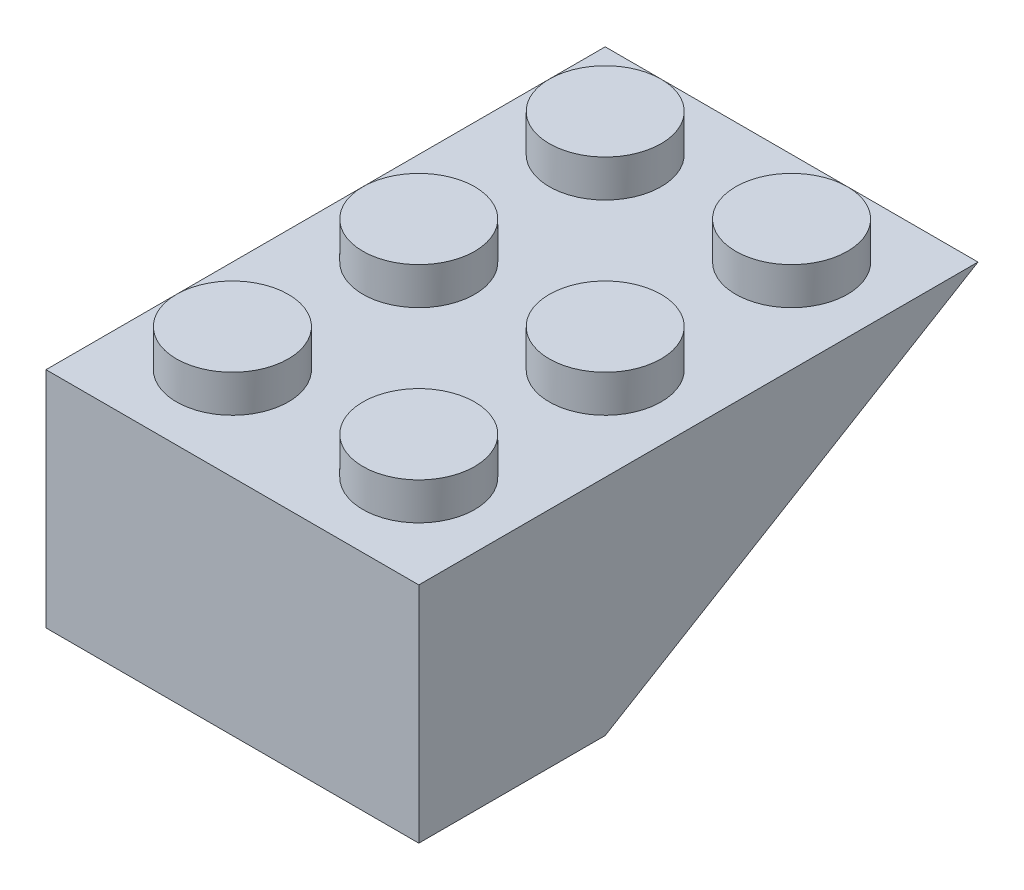
ISO-10303-21;
HEADER;
FILE_DESCRIPTION(('STEP AP214'),'2;1');
FILE_NAME('part.step','',(''),(''),'','','');
FILE_SCHEMA(('AUTOMOTIVE_DESIGN { 1 0 10303 214 1 1 1 1 }'));
ENDSEC;
DATA;
#1=APPLICATION_CONTEXT('core data for automotive mechanical design processes');
#2=APPLICATION_PROTOCOL_DEFINITION('international standard','automotive_design',2000,#1);
#3=PRODUCT_CONTEXT('',#1,'mechanical');
#4=PRODUCT('Part','Part','',(#3));
#5=PRODUCT_RELATED_PRODUCT_CATEGORY('part','',(#4));
#6=PRODUCT_DEFINITION_FORMATION('','',#4);
#7=PRODUCT_DEFINITION_CONTEXT('part definition',#1,'design');
#8=PRODUCT_DEFINITION('design','',#6,#7);
#9=PRODUCT_DEFINITION_SHAPE('','',#8);
#10=(LENGTH_UNIT() NAMED_UNIT(*) SI_UNIT(.MILLI.,.METRE.));
#11=(NAMED_UNIT(*) PLANE_ANGLE_UNIT() SI_UNIT($,.RADIAN.));
#12=(NAMED_UNIT(*) SI_UNIT($,.STERADIAN.) SOLID_ANGLE_UNIT());
#13=UNCERTAINTY_MEASURE_WITH_UNIT(LENGTH_MEASURE(1.E-05),#10,'distance_accuracy_value','');
#14=(GEOMETRIC_REPRESENTATION_CONTEXT(3) GLOBAL_UNCERTAINTY_ASSIGNED_CONTEXT((#13)) GLOBAL_UNIT_ASSIGNED_CONTEXT((#10,
#11,#12)) REPRESENTATION_CONTEXT('',''));
#15=CARTESIAN_POINT('',(0.,0.,0.));
#16=DIRECTION('',(0.,0.,1.));
#17=DIRECTION('',(1.,0.,0.));
#18=AXIS2_PLACEMENT_3D('',#15,#16,#17);
#19=CARTESIAN_POINT('',(0.,0.,0.));
#20=DIRECTION('',(0.,-1.,0.));
#21=DIRECTION('',(0.,0.,-1.));
#22=AXIS2_PLACEMENT_3D('',#19,#20,#21);
#23=PLANE('',#22);
#24=DIRECTION('',(0.,0.,1.));
#25=VECTOR('',#24,1.);
#26=CARTESIAN_POINT('',(0.,0.,0.));
#27=LINE('',#26,#25);
#28=CARTESIAN_POINT('',(0.,0.,-8.));
#29=VERTEX_POINT('',#28);
#30=CARTESIAN_POINT('',(0.,0.,0.));
#31=VERTEX_POINT('',#30);
#32=EDGE_CURVE('E79',#29,#31,#27,.T.);
#33=ORIENTED_EDGE('',*,*,#32,.F.);
#34=DIRECTION('',(-1.,0.,0.));
#35=VECTOR('',#34,1.);
#36=CARTESIAN_POINT('',(0.,0.,-8.));
#37=LINE('',#36,#35);
#38=CARTESIAN_POINT('',(16.,0.,-8.));
#39=VERTEX_POINT('',#38);
#40=EDGE_CURVE('E84',#39,#29,#37,.T.);
#41=ORIENTED_EDGE('',*,*,#40,.F.);
#42=DIRECTION('',(0.,0.,-1.));
#43=VECTOR('',#42,1.);
#44=CARTESIAN_POINT('',(16.,0.,0.));
#45=LINE('',#44,#43);
#46=CARTESIAN_POINT('',(16.,0.,0.));
#47=VERTEX_POINT('',#46);
#48=EDGE_CURVE('E103',#47,#39,#45,.T.);
#49=ORIENTED_EDGE('',*,*,#48,.F.);
#50=DIRECTION('',(1.,0.,0.));
#51=VECTOR('',#50,1.);
#52=CARTESIAN_POINT('',(0.,0.,0.));
#53=LINE('',#52,#51);
#54=EDGE_CURVE('E86',#31,#47,#53,.T.);
#55=ORIENTED_EDGE('',*,*,#54,.F.);
#56=EDGE_LOOP('',(#33,#41,#49,#55));
#57=FACE_BOUND('',#56,.T.);
#58=DIRECTION('',(-1.,0.,0.));
#59=VECTOR('',#58,1.);
#60=CARTESIAN_POINT('',(0.,0.,-6.4));
#61=LINE('',#60,#59);
#62=CARTESIAN_POINT('',(14.4,0.,-6.4));
#63=VERTEX_POINT('',#62);
#64=CARTESIAN_POINT('',(1.6,0.,-6.4));
#65=VERTEX_POINT('',#64);
#66=EDGE_CURVE('E123',#63,#65,#61,.T.);
#67=ORIENTED_EDGE('',*,*,#66,.T.);
#68=DIRECTION('',(0.,0.,1.));
#69=VECTOR('',#68,1.);
#70=CARTESIAN_POINT('',(1.6,0.,0.));
#71=LINE('',#70,#69);
#72=CARTESIAN_POINT('',(1.6,0.,-1.6));
#73=VERTEX_POINT('',#72);
#74=EDGE_CURVE('E109',#65,#73,#71,.T.);
#75=ORIENTED_EDGE('',*,*,#74,.T.);
#76=DIRECTION('',(1.,0.,0.));
#77=VECTOR('',#76,1.);
#78=CARTESIAN_POINT('',(0.,0.,-1.6));
#79=LINE('',#78,#77);
#80=CARTESIAN_POINT('',(14.4,0.,-1.6));
#81=VERTEX_POINT('',#80);
#82=EDGE_CURVE('E140',#73,#81,#79,.T.);
#83=ORIENTED_EDGE('',*,*,#82,.T.);
#84=DIRECTION('',(0.,0.,-1.));
#85=VECTOR('',#84,1.);
#86=CARTESIAN_POINT('',(14.4,0.,0.));
#87=LINE('',#86,#85);
#88=EDGE_CURVE('E54',#81,#63,#87,.T.);
#89=ORIENTED_EDGE('',*,*,#88,.T.);
#90=EDGE_LOOP('',(#67,#75,#83,#89));
#91=FACE_BOUND('',#90,.T.);
#92=ADVANCED_FACE('F39',(#57,#91),#23,.T.);
#93=CARTESIAN_POINT('',(0.,9.6,0.));
#94=DIRECTION('',(1.,0.,0.));
#95=DIRECTION('',(0.,0.,-1.));
#96=AXIS2_PLACEMENT_3D('',#93,#94,#95);
#97=PLANE('',#96);
#98=ORIENTED_EDGE('',*,*,#32,.T.);
#99=DIRECTION('',(0.,-1.,0.));
#100=VECTOR('',#99,1.);
#101=CARTESIAN_POINT('',(0.,9.6,0.));
#102=LINE('',#101,#100);
#103=CARTESIAN_POINT('',(0.,9.6,0.));
#104=VERTEX_POINT('',#103);
#105=EDGE_CURVE('E155',#104,#31,#102,.T.);
#106=ORIENTED_EDGE('',*,*,#105,.F.);
#107=DIRECTION('',(0.,0.,1.));
#108=VECTOR('',#107,1.);
#109=CARTESIAN_POINT('',(0.,9.6,0.));
#110=LINE('',#109,#108);
#111=CARTESIAN_POINT('',(0.,9.6,-24.));
#112=VERTEX_POINT('',#111);
#113=EDGE_CURVE('E102',#112,#104,#110,.T.);
#114=ORIENTED_EDGE('',*,*,#113,.F.);
#115=DIRECTION('',(0.,0.514495755427526,-0.857492925712544));
#116=VECTOR('',#115,1.);
#117=CARTESIAN_POINT('',(0.,0.,-8.));
#118=LINE('',#117,#116);
#119=EDGE_CURVE('E99',#29,#112,#118,.T.);
#120=ORIENTED_EDGE('',*,*,#119,.F.);
#121=EDGE_LOOP('',(#98,#106,#114,#120));
#122=FACE_BOUND('',#121,.T.);
#123=ADVANCED_FACE('F41',(#122),#97,.F.);
#124=CARTESIAN_POINT('',(0.,9.6,0.));
#125=DIRECTION('',(0.,0.,-1.));
#126=DIRECTION('',(-1.,0.,0.));
#127=AXIS2_PLACEMENT_3D('',#124,#125,#126);
#128=PLANE('',#127);
#129=ORIENTED_EDGE('',*,*,#54,.T.);
#130=DIRECTION('',(0.,-1.,0.));
#131=VECTOR('',#130,1.);
#132=CARTESIAN_POINT('',(16.,9.6,0.));
#133=LINE('',#132,#131);
#134=CARTESIAN_POINT('',(16.,9.6,0.));
#135=VERTEX_POINT('',#134);
#136=EDGE_CURVE('E149',#135,#47,#133,.T.);
#137=ORIENTED_EDGE('',*,*,#136,.F.);
#138=DIRECTION('',(1.,0.,0.));
#139=VECTOR('',#138,1.);
#140=CARTESIAN_POINT('',(0.,9.6,0.));
#141=LINE('',#140,#139);
#142=EDGE_CURVE('E63',#104,#135,#141,.T.);
#143=ORIENTED_EDGE('',*,*,#142,.F.);
#144=ORIENTED_EDGE('',*,*,#105,.T.);
#145=EDGE_LOOP('',(#129,#137,#143,#144));
#146=FACE_BOUND('',#145,.T.);
#147=ADVANCED_FACE('F188',(#146),#128,.F.);
#148=CARTESIAN_POINT('',(16.,9.6,0.));
#149=DIRECTION('',(-1.,0.,0.));
#150=DIRECTION('',(0.,0.,1.));
#151=AXIS2_PLACEMENT_3D('',#148,#149,#150);
#152=PLANE('',#151);
#153=ORIENTED_EDGE('',*,*,#48,.T.);
#154=DIRECTION('',(0.,0.514495755427526,-0.857492925712544));
#155=VECTOR('',#154,1.);
#156=CARTESIAN_POINT('',(16.,0.,-8.));
#157=LINE('',#156,#155);
#158=CARTESIAN_POINT('',(16.,9.6,-24.));
#159=VERTEX_POINT('',#158);
#160=EDGE_CURVE('E101',#39,#159,#157,.T.);
#161=ORIENTED_EDGE('',*,*,#160,.T.);
#162=DIRECTION('',(0.,0.,-1.));
#163=VECTOR('',#162,1.);
#164=CARTESIAN_POINT('',(16.,9.6,0.));
#165=LINE('',#164,#163);
#166=EDGE_CURVE('E148',#135,#159,#165,.T.);
#167=ORIENTED_EDGE('',*,*,#166,.F.);
#168=ORIENTED_EDGE('',*,*,#136,.T.);
#169=EDGE_LOOP('',(#153,#161,#167,#168));
#170=FACE_BOUND('',#169,.T.);
#171=ADVANCED_FACE('F177',(#170),#152,.F.);
#172=CARTESIAN_POINT('',(0.,9.6,0.));
#173=DIRECTION('',(0.,-1.,0.));
#174=DIRECTION('',(0.,0.,-1.));
#175=AXIS2_PLACEMENT_3D('',#172,#173,#174);
#176=PLANE('',#175);
#177=CARTESIAN_POINT('',(4.,9.6,-20.));
#178=DIRECTION('',(0.,-1.,0.));
#179=DIRECTION('',(0.,0.,-1.));
#180=AXIS2_PLACEMENT_3D('',#177,#178,#179);
#181=CIRCLE('',#180,2.4);
#182=CARTESIAN_POINT('',(4.,9.6,-22.4));
#183=VERTEX_POINT('',#182);
#184=EDGE_CURVE('E11',#183,#183,#181,.F.);
#185=ORIENTED_EDGE('',*,*,#184,.F.);
#186=EDGE_LOOP('',(#185));
#187=FACE_BOUND('',#186,.T.);
#188=CARTESIAN_POINT('',(4.,9.6,-12.));
#189=DIRECTION('',(0.,-1.,0.));
#190=DIRECTION('',(0.,0.,-1.));
#191=AXIS2_PLACEMENT_3D('',#188,#189,#190);
#192=CIRCLE('',#191,2.4);
#193=CARTESIAN_POINT('',(4.,9.6,-14.4));
#194=VERTEX_POINT('',#193);
#195=EDGE_CURVE('E47',#194,#194,#192,.F.);
#196=ORIENTED_EDGE('',*,*,#195,.F.);
#197=EDGE_LOOP('',(#196));
#198=FACE_BOUND('',#197,.T.);
#199=CARTESIAN_POINT('',(4.,9.6,-4.));
#200=DIRECTION('',(0.,-1.,0.));
#201=DIRECTION('',(0.,0.,-1.));
#202=AXIS2_PLACEMENT_3D('',#199,#200,#201);
#203=CIRCLE('',#202,2.4);
#204=CARTESIAN_POINT('',(4.,9.6,-6.4));
#205=VERTEX_POINT('',#204);
#206=EDGE_CURVE('E166',#205,#205,#203,.F.);
#207=ORIENTED_EDGE('',*,*,#206,.F.);
#208=EDGE_LOOP('',(#207));
#209=FACE_BOUND('',#208,.T.);
#210=CARTESIAN_POINT('',(12.,9.6,-20.));
#211=DIRECTION('',(0.,-1.,0.));
#212=DIRECTION('',(0.,0.,-1.));
#213=AXIS2_PLACEMENT_3D('',#210,#211,#212);
#214=CIRCLE('',#213,2.4);
#215=CARTESIAN_POINT('',(12.,9.6,-22.4));
#216=VERTEX_POINT('',#215);
#217=EDGE_CURVE('E163',#216,#216,#214,.F.);
#218=ORIENTED_EDGE('',*,*,#217,.F.);
#219=EDGE_LOOP('',(#218));
#220=FACE_BOUND('',#219,.T.);
#221=CARTESIAN_POINT('',(12.,9.6,-12.));
#222=DIRECTION('',(0.,-1.,0.));
#223=DIRECTION('',(0.,0.,-1.));
#224=AXIS2_PLACEMENT_3D('',#221,#222,#223);
#225=CIRCLE('',#224,2.4);
#226=CARTESIAN_POINT('',(12.,9.6,-14.4));
#227=VERTEX_POINT('',#226);
#228=EDGE_CURVE('E160',#227,#227,#225,.F.);
#229=ORIENTED_EDGE('',*,*,#228,.F.);
#230=EDGE_LOOP('',(#229));
#231=FACE_BOUND('',#230,.T.);
#232=CARTESIAN_POINT('',(12.,9.6,-4.));
#233=DIRECTION('',(0.,-1.,0.));
#234=DIRECTION('',(0.,0.,-1.));
#235=AXIS2_PLACEMENT_3D('',#232,#233,#234);
#236=CIRCLE('',#235,2.4);
#237=CARTESIAN_POINT('',(12.,9.6,-6.4));
#238=VERTEX_POINT('',#237);
#239=EDGE_CURVE('E157',#238,#238,#236,.F.);
#240=ORIENTED_EDGE('',*,*,#239,.F.);
#241=EDGE_LOOP('',(#240));
#242=FACE_BOUND('',#241,.T.);
#243=ORIENTED_EDGE('',*,*,#113,.T.);
#244=ORIENTED_EDGE('',*,*,#142,.T.);
#245=ORIENTED_EDGE('',*,*,#166,.T.);
#246=DIRECTION('',(1.,0.,0.));
#247=VECTOR('',#246,1.);
#248=CARTESIAN_POINT('',(0.,9.6,-24.));
#249=LINE('',#248,#247);
#250=EDGE_CURVE('E107',#112,#159,#249,.T.);
#251=ORIENTED_EDGE('',*,*,#250,.F.);
#252=EDGE_LOOP('',(#243,#244,#245,#251));
#253=FACE_BOUND('',#252,.T.);
#254=ADVANCED_FACE('F173',(#187,#198,#209,#220,#231,#242,#253),#176,.F.);
#255=CARTESIAN_POINT('',(1.6,9.6,0.));
#256=DIRECTION('',(1.,0.,0.));
#257=DIRECTION('',(0.,0.,-1.));
#258=AXIS2_PLACEMENT_3D('',#255,#256,#257);
#259=PLANE('',#258);
#260=ORIENTED_EDGE('',*,*,#74,.F.);
#261=DIRECTION('',(0.,-1.,0.));
#262=VECTOR('',#261,1.);
#263=CARTESIAN_POINT('',(1.6,9.6,-6.4));
#264=LINE('',#263,#262);
#265=CARTESIAN_POINT('',(1.6,8.,-6.4));
#266=VERTEX_POINT('',#265);
#267=EDGE_CURVE('E124',#266,#65,#264,.T.);
#268=ORIENTED_EDGE('',*,*,#267,.F.);
#269=DIRECTION('',(0.,0.,1.));
#270=VECTOR('',#269,1.);
#271=CARTESIAN_POINT('',(1.6,8.,0.));
#272=LINE('',#271,#270);
#273=CARTESIAN_POINT('',(1.6,8.,-1.6));
#274=VERTEX_POINT('',#273);
#275=EDGE_CURVE('E119',#266,#274,#272,.T.);
#276=ORIENTED_EDGE('',*,*,#275,.T.);
#277=DIRECTION('',(0.,-1.,0.));
#278=VECTOR('',#277,1.);
#279=CARTESIAN_POINT('',(1.6,9.6,-1.6));
#280=LINE('',#279,#278);
#281=EDGE_CURVE('E91',#274,#73,#280,.T.);
#282=ORIENTED_EDGE('',*,*,#281,.T.);
#283=EDGE_LOOP('',(#260,#268,#276,#282));
#284=FACE_BOUND('',#283,.T.);
#285=ADVANCED_FACE('F176',(#284),#259,.T.);
#286=CARTESIAN_POINT('',(0.,9.6,-1.6));
#287=DIRECTION('',(0.,0.,-1.));
#288=DIRECTION('',(-1.,0.,0.));
#289=AXIS2_PLACEMENT_3D('',#286,#287,#288);
#290=PLANE('',#289);
#291=ORIENTED_EDGE('',*,*,#82,.F.);
#292=ORIENTED_EDGE('',*,*,#281,.F.);
#293=DIRECTION('',(1.,0.,0.));
#294=VECTOR('',#293,1.);
#295=CARTESIAN_POINT('',(0.,8.,-1.6));
#296=LINE('',#295,#294);
#297=CARTESIAN_POINT('',(14.4,8.,-1.6));
#298=VERTEX_POINT('',#297);
#299=EDGE_CURVE('E122',#274,#298,#296,.T.);
#300=ORIENTED_EDGE('',*,*,#299,.T.);
#301=DIRECTION('',(0.,-1.,0.));
#302=VECTOR('',#301,1.);
#303=CARTESIAN_POINT('',(14.4,9.6,-1.6));
#304=LINE('',#303,#302);
#305=EDGE_CURVE('E118',#298,#81,#304,.T.);
#306=ORIENTED_EDGE('',*,*,#305,.T.);
#307=EDGE_LOOP('',(#291,#292,#300,#306));
#308=FACE_BOUND('',#307,.T.);
#309=ADVANCED_FACE('F211',(#308),#290,.T.);
#310=CARTESIAN_POINT('',(14.4,9.6,0.));
#311=DIRECTION('',(-1.,0.,0.));
#312=DIRECTION('',(0.,0.,1.));
#313=AXIS2_PLACEMENT_3D('',#310,#311,#312);
#314=PLANE('',#313);
#315=ORIENTED_EDGE('',*,*,#88,.F.);
#316=ORIENTED_EDGE('',*,*,#305,.F.);
#317=DIRECTION('',(0.,0.,-1.));
#318=VECTOR('',#317,1.);
#319=CARTESIAN_POINT('',(14.4,8.,0.));
#320=LINE('',#319,#318);
#321=CARTESIAN_POINT('',(14.4,8.,-6.4));
#322=VERTEX_POINT('',#321);
#323=EDGE_CURVE('E132',#298,#322,#320,.T.);
#324=ORIENTED_EDGE('',*,*,#323,.T.);
#325=DIRECTION('',(0.,-1.,0.));
#326=VECTOR('',#325,1.);
#327=CARTESIAN_POINT('',(14.4,9.6,-6.4));
#328=LINE('',#327,#326);
#329=EDGE_CURVE('E127',#322,#63,#328,.T.);
#330=ORIENTED_EDGE('',*,*,#329,.T.);
#331=EDGE_LOOP('',(#315,#316,#324,#330));
#332=FACE_BOUND('',#331,.T.);
#333=ADVANCED_FACE('F224',(#332),#314,.T.);
#334=CARTESIAN_POINT('',(0.,9.6,-6.4));
#335=DIRECTION('',(0.,0.,1.));
#336=DIRECTION('',(1.,0.,0.));
#337=AXIS2_PLACEMENT_3D('',#334,#335,#336);
#338=PLANE('',#337);
#339=ORIENTED_EDGE('',*,*,#66,.F.);
#340=ORIENTED_EDGE('',*,*,#329,.F.);
#341=DIRECTION('',(-1.,0.,0.));
#342=VECTOR('',#341,1.);
#343=CARTESIAN_POINT('',(0.,8.,-6.4));
#344=LINE('',#343,#342);
#345=EDGE_CURVE('E128',#322,#266,#344,.T.);
#346=ORIENTED_EDGE('',*,*,#345,.T.);
#347=ORIENTED_EDGE('',*,*,#267,.T.);
#348=EDGE_LOOP('',(#339,#340,#346,#347));
#349=FACE_BOUND('',#348,.T.);
#350=ADVANCED_FACE('F219',(#349),#338,.T.);
#351=CARTESIAN_POINT('',(0.,8.,0.));
#352=DIRECTION('',(0.,-1.,0.));
#353=DIRECTION('',(0.,0.,-1.));
#354=AXIS2_PLACEMENT_3D('',#351,#352,#353);
#355=PLANE('',#354);
#356=ORIENTED_EDGE('',*,*,#275,.F.);
#357=ORIENTED_EDGE('',*,*,#345,.F.);
#358=ORIENTED_EDGE('',*,*,#323,.F.);
#359=ORIENTED_EDGE('',*,*,#299,.F.);
#360=EDGE_LOOP('',(#356,#357,#358,#359));
#361=FACE_BOUND('',#360,.T.);
#362=ADVANCED_FACE('F222',(#361),#355,.T.);
#363=CARTESIAN_POINT('',(0.,0.,-8.));
#364=DIRECTION('',(0.,-0.857492925712544,-0.514495755427526));
#365=DIRECTION('',(0.,0.514495755427526,-0.857492925712544));
#366=AXIS2_PLACEMENT_3D('',#363,#364,#365);
#367=PLANE('',#366);
#368=ORIENTED_EDGE('',*,*,#160,.F.);
#369=ORIENTED_EDGE('',*,*,#40,.T.);
#370=ORIENTED_EDGE('',*,*,#119,.T.);
#371=ORIENTED_EDGE('',*,*,#250,.T.);
#372=EDGE_LOOP('',(#368,#369,#370,#371));
#373=FACE_BOUND('',#372,.T.);
#374=ADVANCED_FACE('F96',(#373),#367,.T.);
#375=CARTESIAN_POINT('',(12.,11.2,-4.));
#376=DIRECTION('',(0.,-1.,0.));
#377=DIRECTION('',(0.,0.,-1.));
#378=AXIS2_PLACEMENT_3D('',#375,#376,#377);
#379=CYLINDRICAL_SURFACE('',#378,2.4);
#380=CARTESIAN_POINT('',(12.,11.2,-4.));
#381=DIRECTION('',(0.,1.,0.));
#382=DIRECTION('',(0.,0.,1.));
#383=AXIS2_PLACEMENT_3D('',#380,#381,#382);
#384=CIRCLE('',#383,2.4);
#385=CARTESIAN_POINT('',(12.,11.2,-1.6));
#386=VERTEX_POINT('',#385);
#387=EDGE_CURVE('E111',#386,#386,#384,.T.);
#388=ORIENTED_EDGE('',*,*,#387,.F.);
#389=EDGE_LOOP('',(#388));
#390=FACE_BOUND('',#389,.T.);
#391=ORIENTED_EDGE('',*,*,#239,.T.);
#392=EDGE_LOOP('',(#391));
#393=FACE_BOUND('',#392,.T.);
#394=ADVANCED_FACE('F315',(#390,#393),#379,.T.);
#395=CARTESIAN_POINT('',(12.,11.2,-4.));
#396=DIRECTION('',(0.,1.,0.));
#397=DIRECTION('',(0.,0.,1.));
#398=AXIS2_PLACEMENT_3D('',#395,#396,#397);
#399=PLANE('',#398);
#400=ORIENTED_EDGE('',*,*,#387,.T.);
#401=EDGE_LOOP('',(#400));
#402=FACE_BOUND('',#401,.T.);
#403=ADVANCED_FACE('F323',(#402),#399,.T.);
#404=CARTESIAN_POINT('',(12.,11.2,-12.));
#405=DIRECTION('',(0.,-1.,0.));
#406=DIRECTION('',(0.,0.,-1.));
#407=AXIS2_PLACEMENT_3D('',#404,#405,#406);
#408=CYLINDRICAL_SURFACE('',#407,2.4);
#409=CARTESIAN_POINT('',(12.,11.2,-12.));
#410=DIRECTION('',(0.,1.,0.));
#411=DIRECTION('',(0.,0.,1.));
#412=AXIS2_PLACEMENT_3D('',#409,#410,#411);
#413=CIRCLE('',#412,2.4);
#414=CARTESIAN_POINT('',(12.,11.2,-9.6));
#415=VERTEX_POINT('',#414);
#416=EDGE_CURVE('E447',#415,#415,#413,.T.);
#417=ORIENTED_EDGE('',*,*,#416,.F.);
#418=EDGE_LOOP('',(#417));
#419=FACE_BOUND('',#418,.T.);
#420=ORIENTED_EDGE('',*,*,#228,.T.);
#421=EDGE_LOOP('',(#420));
#422=FACE_BOUND('',#421,.T.);
#423=ADVANCED_FACE('F331',(#419,#422),#408,.T.);
#424=CARTESIAN_POINT('',(12.,11.2,-12.));
#425=DIRECTION('',(0.,1.,0.));
#426=DIRECTION('',(0.,0.,1.));
#427=AXIS2_PLACEMENT_3D('',#424,#425,#426);
#428=PLANE('',#427);
#429=ORIENTED_EDGE('',*,*,#416,.T.);
#430=EDGE_LOOP('',(#429));
#431=FACE_BOUND('',#430,.T.);
#432=ADVANCED_FACE('F339',(#431),#428,.T.);
#433=CARTESIAN_POINT('',(12.,11.2,-20.));
#434=DIRECTION('',(0.,-1.,0.));
#435=DIRECTION('',(0.,0.,-1.));
#436=AXIS2_PLACEMENT_3D('',#433,#434,#435);
#437=CYLINDRICAL_SURFACE('',#436,2.4);
#438=CARTESIAN_POINT('',(12.,11.2,-20.));
#439=DIRECTION('',(0.,1.,0.));
#440=DIRECTION('',(0.,0.,1.));
#441=AXIS2_PLACEMENT_3D('',#438,#439,#440);
#442=CIRCLE('',#441,2.4);
#443=CARTESIAN_POINT('',(12.,11.2,-17.6));
#444=VERTEX_POINT('',#443);
#445=EDGE_CURVE('E445',#444,#444,#442,.T.);
#446=ORIENTED_EDGE('',*,*,#445,.F.);
#447=EDGE_LOOP('',(#446));
#448=FACE_BOUND('',#447,.T.);
#449=ORIENTED_EDGE('',*,*,#217,.T.);
#450=EDGE_LOOP('',(#449));
#451=FACE_BOUND('',#450,.T.);
#452=ADVANCED_FACE('F348',(#448,#451),#437,.T.);
#453=CARTESIAN_POINT('',(12.,11.2,-20.));
#454=DIRECTION('',(0.,1.,0.));
#455=DIRECTION('',(0.,0.,1.));
#456=AXIS2_PLACEMENT_3D('',#453,#454,#455);
#457=PLANE('',#456);
#458=ORIENTED_EDGE('',*,*,#445,.T.);
#459=EDGE_LOOP('',(#458));
#460=FACE_BOUND('',#459,.T.);
#461=ADVANCED_FACE('F357',(#460),#457,.T.);
#462=CARTESIAN_POINT('',(4.,11.2,-4.));
#463=DIRECTION('',(0.,-1.,0.));
#464=DIRECTION('',(0.,0.,-1.));
#465=AXIS2_PLACEMENT_3D('',#462,#463,#464);
#466=CYLINDRICAL_SURFACE('',#465,2.4);
#467=CARTESIAN_POINT('',(4.,11.2,-4.));
#468=DIRECTION('',(0.,1.,0.));
#469=DIRECTION('',(0.,0.,1.));
#470=AXIS2_PLACEMENT_3D('',#467,#468,#469);
#471=CIRCLE('',#470,2.4);
#472=CARTESIAN_POINT('',(4.,11.2,-1.6));
#473=VERTEX_POINT('',#472);
#474=EDGE_CURVE('E440',#473,#473,#471,.T.);
#475=ORIENTED_EDGE('',*,*,#474,.F.);
#476=EDGE_LOOP('',(#475));
#477=FACE_BOUND('',#476,.T.);
#478=ORIENTED_EDGE('',*,*,#206,.T.);
#479=EDGE_LOOP('',(#478));
#480=FACE_BOUND('',#479,.T.);
#481=ADVANCED_FACE('F366',(#477,#480),#466,.T.);
#482=CARTESIAN_POINT('',(4.,11.2,-4.));
#483=DIRECTION('',(0.,1.,0.));
#484=DIRECTION('',(0.,0.,1.));
#485=AXIS2_PLACEMENT_3D('',#482,#483,#484);
#486=PLANE('',#485);
#487=ORIENTED_EDGE('',*,*,#474,.T.);
#488=EDGE_LOOP('',(#487));
#489=FACE_BOUND('',#488,.T.);
#490=ADVANCED_FACE('F375',(#489),#486,.T.);
#491=CARTESIAN_POINT('',(4.,11.2,-12.));
#492=DIRECTION('',(0.,-1.,0.));
#493=DIRECTION('',(0.,0.,-1.));
#494=AXIS2_PLACEMENT_3D('',#491,#492,#493);
#495=CYLINDRICAL_SURFACE('',#494,2.4);
#496=CARTESIAN_POINT('',(4.,11.2,-12.));
#497=DIRECTION('',(0.,1.,0.));
#498=DIRECTION('',(0.,0.,1.));
#499=AXIS2_PLACEMENT_3D('',#496,#497,#498);
#500=CIRCLE('',#499,2.4);
#501=CARTESIAN_POINT('',(4.,11.2,-9.6));
#502=VERTEX_POINT('',#501);
#503=EDGE_CURVE('E437',#502,#502,#500,.T.);
#504=ORIENTED_EDGE('',*,*,#503,.F.);
#505=EDGE_LOOP('',(#504));
#506=FACE_BOUND('',#505,.T.);
#507=ORIENTED_EDGE('',*,*,#195,.T.);
#508=EDGE_LOOP('',(#507));
#509=FACE_BOUND('',#508,.T.);
#510=ADVANCED_FACE('F171',(#506,#509),#495,.T.);
#511=CARTESIAN_POINT('',(4.,11.2,-12.));
#512=DIRECTION('',(0.,1.,0.));
#513=DIRECTION('',(0.,0.,1.));
#514=AXIS2_PLACEMENT_3D('',#511,#512,#513);
#515=PLANE('',#514);
#516=ORIENTED_EDGE('',*,*,#503,.T.);
#517=EDGE_LOOP('',(#516));
#518=FACE_BOUND('',#517,.T.);
#519=ADVANCED_FACE('F392',(#518),#515,.T.);
#520=CARTESIAN_POINT('',(4.,11.2,-20.));
#521=DIRECTION('',(0.,-1.,0.));
#522=DIRECTION('',(0.,0.,-1.));
#523=AXIS2_PLACEMENT_3D('',#520,#521,#522);
#524=CYLINDRICAL_SURFACE('',#523,2.4);
#525=CARTESIAN_POINT('',(4.,11.2,-20.));
#526=DIRECTION('',(0.,1.,0.));
#527=DIRECTION('',(0.,0.,1.));
#528=AXIS2_PLACEMENT_3D('',#525,#526,#527);
#529=CIRCLE('',#528,2.4);
#530=CARTESIAN_POINT('',(4.,11.2,-17.6));
#531=VERTEX_POINT('',#530);
#532=EDGE_CURVE('E436',#531,#531,#529,.T.);
#533=ORIENTED_EDGE('',*,*,#532,.F.);
#534=EDGE_LOOP('',(#533));
#535=FACE_BOUND('',#534,.T.);
#536=ORIENTED_EDGE('',*,*,#184,.T.);
#537=EDGE_LOOP('',(#536));
#538=FACE_BOUND('',#537,.T.);
#539=ADVANCED_FACE('F401',(#535,#538),#524,.T.);
#540=CARTESIAN_POINT('',(4.,11.2,-20.));
#541=DIRECTION('',(0.,1.,0.));
#542=DIRECTION('',(0.,0.,1.));
#543=AXIS2_PLACEMENT_3D('',#540,#541,#542);
#544=PLANE('',#543);
#545=ORIENTED_EDGE('',*,*,#532,.T.);
#546=EDGE_LOOP('',(#545));
#547=FACE_BOUND('',#546,.T.);
#548=ADVANCED_FACE('F410',(#547),#544,.T.);
#549=CLOSED_SHELL('',(#92,#123,#147,#171,#254,#285,#309,#333,#350,#362,#374,#394,#403,#423,#432,
#452,#461,#481,#490,#510,#519,#539,#548));
#550=MANIFOLD_SOLID_BREP('B2',#549);
#551=ADVANCED_BREP_SHAPE_REPRESENTATION('',(#18,#550),#14);
#552=SHAPE_DEFINITION_REPRESENTATION(#9,#551);
ENDSEC;
END-ISO-10303-21;
